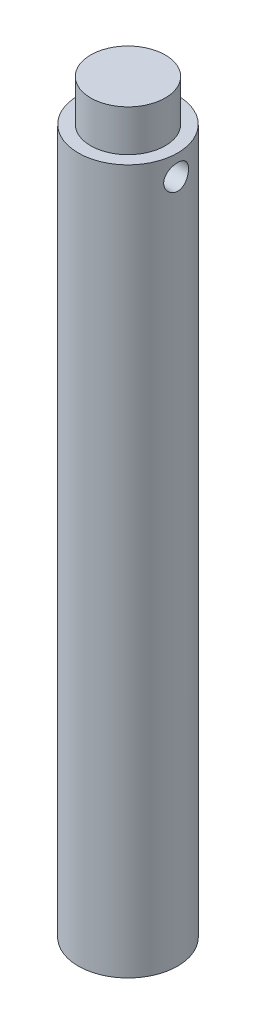
ISO-10303-21;
HEADER;
FILE_DESCRIPTION(('STEP AP214'),'2;1');
FILE_NAME('part.step','',(''),(''),'','','');
FILE_SCHEMA(('AUTOMOTIVE_DESIGN { 1 0 10303 214 1 1 1 1 }'));
ENDSEC;
DATA;
#1=APPLICATION_CONTEXT('core data for automotive mechanical design processes');
#2=APPLICATION_PROTOCOL_DEFINITION('international standard','automotive_design',2000,#1);
#3=PRODUCT_CONTEXT('',#1,'mechanical');
#4=PRODUCT('Part','Part','',(#3));
#5=PRODUCT_RELATED_PRODUCT_CATEGORY('part','',(#4));
#6=PRODUCT_DEFINITION_FORMATION('','',#4);
#7=PRODUCT_DEFINITION_CONTEXT('part definition',#1,'design');
#8=PRODUCT_DEFINITION('design','',#6,#7);
#9=PRODUCT_DEFINITION_SHAPE('','',#8);
#10=(LENGTH_UNIT() NAMED_UNIT(*) SI_UNIT(.MILLI.,.METRE.));
#11=(NAMED_UNIT(*) PLANE_ANGLE_UNIT() SI_UNIT($,.RADIAN.));
#12=(NAMED_UNIT(*) SI_UNIT($,.STERADIAN.) SOLID_ANGLE_UNIT());
#13=UNCERTAINTY_MEASURE_WITH_UNIT(LENGTH_MEASURE(1.E-05),#10,'distance_accuracy_value','');
#14=(GEOMETRIC_REPRESENTATION_CONTEXT(3) GLOBAL_UNCERTAINTY_ASSIGNED_CONTEXT((#13)) GLOBAL_UNIT_ASSIGNED_CONTEXT((#10,
#11,#12)) REPRESENTATION_CONTEXT('',''));
#15=CARTESIAN_POINT('',(0.,0.,0.));
#16=DIRECTION('',(0.,0.,1.));
#17=DIRECTION('',(1.,0.,0.));
#18=AXIS2_PLACEMENT_3D('',#15,#16,#17);
#19=CARTESIAN_POINT('',(0.,-80.,0.));
#20=DIRECTION('',(0.,1.,0.));
#21=DIRECTION('',(0.,0.,1.));
#22=AXIS2_PLACEMENT_3D('',#19,#20,#21);
#23=CYLINDRICAL_SURFACE('',#22,6.);
#24=CARTESIAN_POINT('',(-6.,4.,0.));
#25=CARTESIAN_POINT('',(-5.99999859868013,3.99999767426184,-0.0828760886697311));
#26=CARTESIAN_POINT('',(-5.99826578131828,3.99310844922621,-0.165778157830763));
#27=CARTESIAN_POINT('',(-5.99152113829892,3.965774848693,-0.329206323770533));
#28=CARTESIAN_POINT('',(-5.98650745419968,3.94532279046215,-0.409731046870739));
#29=CARTESIAN_POINT('',(-5.9737562633204,3.89156074653791,-0.566020872182577));
#30=CARTESIAN_POINT('',(-5.96602202842087,3.85826620128472,-0.641791563430003));
#31=CARTESIAN_POINT('',(-5.94865343807593,3.77981860995517,-0.786672131904426));
#32=CARTESIAN_POINT('',(-5.9390190185405,3.73466516388106,-0.855781784348759));
#33=CARTESIAN_POINT('',(-5.91867413591801,3.63279921034579,-0.98680192730092));
#34=CARTESIAN_POINT('',(-5.90794707148533,3.57588842504082,-1.04855569006107));
#35=CARTESIAN_POINT('',(-5.8867362011753,3.45254779509108,-1.1617489272033));
#36=CARTESIAN_POINT('',(-5.87625242288348,3.3861168770535,-1.21318723694913));
#37=CARTESIAN_POINT('',(-5.8565477569971,3.24440477326256,-1.30502654279903));
#38=CARTESIAN_POINT('',(-5.84734794470605,3.1690067691896,-1.34525221592536));
#39=CARTESIAN_POINT('',(-5.83149494812223,3.01225158834164,-1.41239690855053));
#40=CARTESIAN_POINT('',(-5.82484135672789,2.93089536667424,-1.43931805543933));
#41=CARTESIAN_POINT('',(-5.81500476717551,2.76625650179753,-1.47855483680429));
#42=CARTESIAN_POINT('',(-5.81175491075426,2.6830451039502,-1.49115226833334));
#43=CARTESIAN_POINT('',(-5.80889362537741,2.51563143098602,-1.50226177506785));
#44=CARTESIAN_POINT('',(-5.80928160448644,2.43142931930139,-1.50077614181798));
#45=CARTESIAN_POINT('',(-5.81359205496618,2.26658419225552,-1.48398652463928));
#46=CARTESIAN_POINT('',(-5.81742863001879,2.1859043785349,-1.46901834019052));
#47=CARTESIAN_POINT('',(-5.82806709676484,2.02823894908871,-1.42622418690311));
#48=CARTESIAN_POINT('',(-5.83486919970696,1.95125359697102,-1.39839730206942));
#49=CARTESIAN_POINT('',(-5.85075113904187,1.80226198374793,-1.33038947793715));
#50=CARTESIAN_POINT('',(-5.85985327469421,1.73031382821045,-1.29008666723291));
#51=CARTESIAN_POINT('',(-5.87929710846386,1.59408129024316,-1.19835627601495));
#52=CARTESIAN_POINT('',(-5.88963902334735,1.52979825193274,-1.14692674880884));
#53=CARTESIAN_POINT('',(-5.91075880539781,1.4087963843056,-1.03266342468122));
#54=CARTESIAN_POINT('',(-5.92154069477971,1.35234550993865,-0.96954625816586));
#55=CARTESIAN_POINT('',(-5.94205965578786,1.2507787575361,-0.8346119175037));
#56=CARTESIAN_POINT('',(-5.95179669549415,1.20566322573643,-0.762794477707944));
#57=CARTESIAN_POINT('',(-5.96917732094183,1.12794941377561,-0.612115888681391));
#58=CARTESIAN_POINT('',(-5.97681360127725,1.09539465974557,-0.533231393208623));
#59=CARTESIAN_POINT('',(-5.98907916991419,1.04408269429043,-0.370876008142882));
#60=CARTESIAN_POINT('',(-5.99370903339281,1.02532284358186,-0.287405999150485));
#61=CARTESIAN_POINT('',(-5.99935499271375,1.00254243444116,-0.120539970390027));
#62=CARTESIAN_POINT('',(-6.00046053508279,0.998156973924699,-0.0371967199882099));
#63=CARTESIAN_POINT('',(-5.99918804814451,1.00324900205549,0.129032874801508));
#64=CARTESIAN_POINT('',(-5.99681033241847,1.01272524279913,0.211919259644595));
#65=CARTESIAN_POINT('',(-5.98889581127357,1.04497090839138,0.373614268776492));
#66=CARTESIAN_POINT('',(-5.98340634185811,1.06754126347699,0.452465118968755));
#67=CARTESIAN_POINT('',(-5.96988706634134,1.12510708402845,0.605257292452511));
#68=CARTESIAN_POINT('',(-5.96185700369892,1.16010380431317,0.679198119032635));
#69=CARTESIAN_POINT('',(-5.9439330792631,1.24223612887473,0.821523134429848));
#70=CARTESIAN_POINT('',(-5.93400867366932,1.28957611239676,0.889785441835831));
#71=CARTESIAN_POINT('',(-5.91344509187419,1.39478990879697,1.01752661364325));
#72=CARTESIAN_POINT('',(-5.90280579251705,1.45266553961691,1.07700395897301));
#73=CARTESIAN_POINT('',(-5.88168956960771,1.57900196084446,1.18699056807273));
#74=CARTESIAN_POINT('',(-5.87122304187281,1.64768770300242,1.23724386762203));
#75=CARTESIAN_POINT('',(-5.85192878377239,1.79273263446572,1.3255107590127));
#76=CARTESIAN_POINT('',(-5.84310098067026,1.86909148295975,1.36352489415794));
#77=CARTESIAN_POINT('',(-5.82818094734665,2.02690572241308,1.42595142060929));
#78=CARTESIAN_POINT('',(-5.82207255291906,2.10832762834401,1.45044439665406));
#79=CARTESIAN_POINT('',(-5.81326744090184,2.27430963788911,1.48534565995378));
#80=CARTESIAN_POINT('',(-5.81056997719936,2.35886905103249,1.49575702747866));
#81=CARTESIAN_POINT('',(-5.80894901203957,2.5261210238552,1.50203859033399));
#82=CARTESIAN_POINT('',(-5.80991932728264,2.60879743512473,1.49831789778012));
#83=CARTESIAN_POINT('',(-5.81527909007843,2.77230388866798,1.47737727831287));
#84=CARTESIAN_POINT('',(-5.81966846891857,2.85313396801365,1.46015762268677));
#85=CARTESIAN_POINT('',(-5.83131260682723,3.01020845906541,1.41293131944279));
#86=CARTESIAN_POINT('',(-5.8385501523631,3.08647730524021,1.38300140468038));
#87=CARTESIAN_POINT('',(-5.85507755724829,3.23296538271369,1.31126491360507));
#88=CARTESIAN_POINT('',(-5.86436770120773,3.30318377318692,1.26945669003419));
#89=CARTESIAN_POINT('',(-5.88425634263512,3.43755462900202,1.17386774863714));
#90=CARTESIAN_POINT('',(-5.89488264831757,3.50150107342396,1.11980316291225));
#91=CARTESIAN_POINT('',(-5.91608027246286,3.61954704479541,1.00178937118973));
#92=CARTESIAN_POINT('',(-5.9266515772706,3.67364423011297,0.937837821261145));
#93=CARTESIAN_POINT('',(-5.94677655647663,3.77141130856461,0.800467586702589));
#94=CARTESIAN_POINT('',(-5.95630833365868,3.81487461367158,0.726898422316385));
#95=CARTESIAN_POINT('',(-5.97304924975118,3.88874746294053,0.573266059510474));
#96=CARTESIAN_POINT('',(-5.98026005199781,3.91916636064854,0.493207563436738));
#97=CARTESIAN_POINT('',(-5.99048059565542,3.96157183032965,0.34441025324347));
#98=CARTESIAN_POINT('',(-5.99402585052691,3.97595124305343,0.276380170908067));
#99=CARTESIAN_POINT('',(-5.99878605231948,3.99516594362194,0.138906071536282));
#100=CARTESIAN_POINT('',(-6.00000117450894,4.0000019493053,0.0694621612426158));
#101=CARTESIAN_POINT('',(-6.,4.,0.));
#102=B_SPLINE_CURVE_WITH_KNOTS('',3,(#24,#25,#26,#27,#28,#29,#30,#31,#32,#33,#34,#35,#36,#37,
#38,#39,#40,#41,#42,#43,#44,#45,#46,#47,#48,#49,#50,#51,#52,#53,#54,#55,#56,#57,#58,#59,#60,#61,
#62,#63,#64,#65,#66,#67,#68,#69,#70,#71,#72,#73,#74,#75,#76,#77,#78,#79,#80,#81,#82,#83,#84,#85,
#86,#87,#88,#89,#90,#91,#92,#93,#94,#95,#96,#97,#98,#99,#100,#101),.UNSPECIFIED.,.T.,.F.,(4,2,2,
2,2,2,2,2,2,2,2,2,2,2,2,2,2,2,2,2,2,2,2,2,2,2,2,2,2,2,2,2,2,2,2,2,2,2,4),(0.,0.24837371247189,
0.4968882377639,0.745104902286106,0.993329940169328,1.24614435437139,1.49898729580062,
1.75558647545807,2.01214461169368,2.2635629509943,2.51494038112697,2.76022497007018,
3.00552703466038,3.25330527873879,3.50112690836163,3.75601500969019,4.01091089558247,
4.26668229009114,4.52240473688643,4.77158308949276,5.02073901112743,5.26620274514037,
5.51169127322291,5.76153587565352,6.01142363008019,6.26744509204476,6.52345518749508,
6.77792254614036,7.03233423252408,7.27943780398612,7.52653640956034,7.77216400559447,
8.01782568136901,8.2698957640991,8.52202569770418,8.77872185499588,9.0352336382135,
9.24342242942149,9.45159556043039),.UNSPECIFIED.);
#103=CARTESIAN_POINT('',(-6.,4.,0.));
#104=VERTEX_POINT('',#103);
#105=EDGE_CURVE('E10',#104,#104,#102,.T.);
#106=ORIENTED_EDGE('',*,*,#105,.F.);
#107=EDGE_LOOP('',(#106));
#108=FACE_BOUND('',#107,.T.);
#109=CARTESIAN_POINT('',(5.80947501931113,2.5,-1.5));
#110=CARTESIAN_POINT('',(5.80947660051185,2.58283045055477,-1.49999764715507));
#111=CARTESIAN_POINT('',(5.81126583608348,2.6656869392068,-1.49311574729838));
#112=CARTESIAN_POINT('',(5.81821117195949,2.82902054690442,-1.46581387527848));
#113=CARTESIAN_POINT('',(5.82336923173088,2.909496252681,-1.44538602404532));
#114=CARTESIAN_POINT('',(5.8364323475758,3.06568212291222,-1.39169471977917));
#115=CARTESIAN_POINT('',(5.84433385614245,3.1413982932314,-1.35844783671268));
#116=CARTESIAN_POINT('',(5.86198915217285,3.28618651152395,-1.28011268475685));
#117=CARTESIAN_POINT('',(5.87174301827101,3.35525827724814,-1.23502391313642));
#118=CARTESIAN_POINT('',(5.89224429813367,3.48631698715732,-1.13322505638712));
#119=CARTESIAN_POINT('',(5.90300758573818,3.54813616021003,-1.07630213262243));
#120=CARTESIAN_POINT('',(5.92417725309178,3.66145683661621,-0.952909238460399));
#121=CARTESIAN_POINT('',(5.93458359939834,3.71295737537305,-0.886438376508185));
#122=CARTESIAN_POINT('',(5.95404249312349,3.80486528057877,-0.744687120647373));
#123=CARTESIAN_POINT('',(5.96307412440355,3.84510783289688,-0.669296745717073));
#124=CARTESIAN_POINT('',(5.9785848715559,3.91228578649185,-0.512557910575659));
#125=CARTESIAN_POINT('',(5.98506436400607,3.93922315114931,-0.431210331475166));
#126=CARTESIAN_POINT('',(5.99462855308908,3.97848870074715,-0.266615255252498));
#127=CARTESIAN_POINT('',(5.99777936306589,3.99110178659595,-0.183439631729387));
#128=CARTESIAN_POINT('',(6.00056156464379,4.00225502756533,-0.0160972915576628));
#129=CARTESIAN_POINT('',(6.00019347658022,4.00079726332576,0.0680692767228401));
#130=CARTESIAN_POINT('',(5.99602856972121,3.98405508984991,0.23302837075858));
#131=CARTESIAN_POINT('',(5.99230801404524,3.96907820496769,0.3138543234016));
#132=CARTESIAN_POINT('',(5.98194501914912,3.9262172379709,0.471807371120529));
#133=CARTESIAN_POINT('',(5.97530242439065,3.89833246877355,0.548934269055656));
#134=CARTESIAN_POINT('',(5.95972505820537,3.83019845758776,0.698110055252709));
#135=CARTESIAN_POINT('',(5.95077011817032,3.78983977320295,0.770106764649756));
#136=CARTESIAN_POINT('',(5.9315394228579,3.69798659253025,0.906413433510733));
#137=CARTESIAN_POINT('',(5.92126343791494,3.64649015886363,0.970722052628258));
#138=CARTESIAN_POINT('',(5.90018228261712,3.53217475481057,1.09166105262743));
#139=CARTESIAN_POINT('',(5.88937031715551,3.46908706459134,1.1480365186128));
#140=CARTESIAN_POINT('',(5.86869026110024,3.33424001587585,1.24946456394453));
#141=CARTESIAN_POINT('',(5.85882221463582,3.2624802523054,1.29451661406902));
#142=CARTESIAN_POINT('',(5.84112298098989,3.11182597951062,1.3721821935339));
#143=CARTESIAN_POINT('',(5.83330190235432,3.03289856181208,1.40473435045574));
#144=CARTESIAN_POINT('',(5.82071184083974,2.87044871915413,1.45602843095451));
#145=CARTESIAN_POINT('',(5.81594220486131,2.78692728161012,1.47477330982936));
#146=CARTESIAN_POINT('',(5.81013213623485,2.62002429908613,1.49749778319911));
#147=CARTESIAN_POINT('',(5.80899653456189,2.53669732400222,1.50185428435178));
#148=CARTESIAN_POINT('',(5.81032406088624,2.37050683805311,1.49671019430933));
#149=CARTESIAN_POINT('',(5.8127868576076,2.28764328522926,1.48721087870928));
#150=CARTESIAN_POINT('',(5.82094249172736,2.12613144102718,1.4549552783626));
#151=CARTESIAN_POINT('',(5.82658182140625,2.04743636405749,1.43241844096905));
#152=CARTESIAN_POINT('',(5.84040430962578,1.89494112528899,1.37497084900237));
#153=CARTESIAN_POINT('',(5.84858776949168,1.8211415445668,1.34005862862753));
#154=CARTESIAN_POINT('',(5.86677682255958,1.67893523327959,1.25806240076193));
#155=CARTESIAN_POINT('',(5.87681501163985,1.61066269597414,1.21075305230138));
#156=CARTESIAN_POINT('',(5.8975024984303,1.48288698231919,1.10559043940168));
#157=CARTESIAN_POINT('',(5.90815189637082,1.42338525000996,1.04773544220816));
#158=CARTESIAN_POINT('',(5.92918441818964,1.31331337445743,0.921394081477089));
#159=CARTESIAN_POINT('',(5.93955421237102,1.26300396247071,0.85267792879739));
#160=CARTESIAN_POINT('',(5.95858329968241,1.17463847982925,0.707554024042014));
#161=CARTESIAN_POINT('',(5.96724268202376,1.13658177003508,0.631146673436387));
#162=CARTESIAN_POINT('',(5.98182069442989,1.07413237928324,0.473337302596636));
#163=CARTESIAN_POINT('',(5.98775898013446,1.04964142937256,0.391976071541822));
#164=CARTESIAN_POINT('',(5.99631176037473,1.01472379923495,0.226124640478212));
#165=CARTESIAN_POINT('',(5.99892689636045,1.00429440475657,0.141635047561866));
#166=CARTESIAN_POINT('',(6.00051254113217,0.997948615636699,-0.0256252896649889));
#167=CARTESIAN_POINT('',(5.99957968320012,1.00164743635691,-0.108380740449049));
#168=CARTESIAN_POINT('',(5.99438844686135,1.0225717409415,-0.272051244622109));
#169=CARTESIAN_POINT('',(5.99013016735643,1.03979682251965,-0.352966352671329));
#170=CARTESIAN_POINT('',(5.97878149280944,1.08707832965639,-0.510256553467224));
#171=CARTESIAN_POINT('',(5.97170646753999,1.11706517997194,-0.586653741871528));
#172=CARTESIAN_POINT('',(5.95546933370076,1.18895586852899,-0.733375579562202));
#173=CARTESIAN_POINT('',(5.94630696206604,1.23086120900435,-0.803699461897577));
#174=CARTESIAN_POINT('',(5.92660874521999,1.32657285099561,-0.938102892635849));
#175=CARTESIAN_POINT('',(5.91604525418417,1.38064021436107,-1.00199248245088));
#176=CARTESIAN_POINT('',(5.89485973579863,1.4986342779607,-1.11992253040688));
#177=CARTESIAN_POINT('',(5.88423769428834,1.56256347414686,-1.17396048760228));
#178=CARTESIAN_POINT('',(5.86391213790822,1.699902121302,-1.27164303971884));
#179=CARTESIAN_POINT('',(5.85422945594827,1.77346618511894,-1.31507492916982));
#180=CARTESIAN_POINT('',(5.83715933325924,1.92708323488405,-1.3888903449235));
#181=CARTESIAN_POINT('',(5.82977022370054,2.00713144916011,-1.41928336463958));
#182=CARTESIAN_POINT('',(5.81927863109675,2.15586551774007,-1.46163379284816));
#183=CARTESIAN_POINT('',(5.8156299450082,2.22383974657579,-1.47598975589307));
#184=CARTESIAN_POINT('',(5.81072757878358,2.36120330349995,-1.4951734388599));
#185=CARTESIAN_POINT('',(5.80947369434945,2.43059251036759,-1.50000197155828));
#186=CARTESIAN_POINT('',(5.80947501931113,2.5,-1.5));
#187=B_SPLINE_CURVE_WITH_KNOTS('',3,(#109,#110,#111,#112,#113,#114,#115,#116,#117,#118,#119,
#120,#121,#122,#123,#124,#125,#126,#127,#128,#129,#130,#131,#132,#133,#134,#135,#136,#137,#138,
#139,#140,#141,#142,#143,#144,#145,#146,#147,#148,#149,#150,#151,#152,#153,#154,#155,#156,#157,
#158,#159,#160,#161,#162,#163,#164,#165,#166,#167,#168,#169,#170,#171,#172,#173,#174,#175,#176,
#177,#178,#179,#180,#181,#182,#183,#184,#185,#186),.UNSPECIFIED.,.T.,.F.,(4,2,2,2,2,2,2,2,2,2,2,
2,2,2,2,2,2,2,2,2,2,2,2,2,2,2,2,2,2,2,2,2,2,2,2,2,2,2,4),(0.,0.248236465041682,
0.496617444857199,0.744678436299612,0.992749960532871,1.24574372515786,1.4987611288792,
1.75530897838752,2.01181895908255,2.26313250597208,2.51440889199612,2.76010957613368,
3.00582334034872,3.25375724552667,3.50173431281348,3.75642279943147,4.01112318719881,
4.26705859205041,4.52293920077728,4.7720614485703,5.02116076310281,5.26618443005524,
5.5112371285285,5.76109707515494,6.01099811331027,6.26715198579191,6.52329249431732,
6.77755243684157,7.03176329345423,7.27910067676474,7.52643070426189,7.77242925935826,
8.01845883442843,8.27038257949243,8.52237018939305,8.77905886370806,9.03556032819972,
9.24358696306398,9.45159585059712),.UNSPECIFIED.);
#188=CARTESIAN_POINT('',(5.80947501931113,2.5,-1.5));
#189=VERTEX_POINT('',#188);
#190=EDGE_CURVE('E43',#189,#189,#187,.T.);
#191=ORIENTED_EDGE('',*,*,#190,.F.);
#192=EDGE_LOOP('',(#191));
#193=FACE_BOUND('',#192,.T.);
#194=CARTESIAN_POINT('',(0.,-80.,0.));
#195=DIRECTION('',(0.,1.,0.));
#196=DIRECTION('',(0.,0.,1.));
#197=AXIS2_PLACEMENT_3D('',#194,#195,#196);
#198=CIRCLE('',#197,6.);
#199=CARTESIAN_POINT('',(0.,-80.,6.));
#200=VERTEX_POINT('',#199);
#201=EDGE_CURVE('E47',#200,#200,#198,.T.);
#202=ORIENTED_EDGE('',*,*,#201,.T.);
#203=EDGE_LOOP('',(#202));
#204=FACE_BOUND('',#203,.T.);
#205=CARTESIAN_POINT('',(0.,5.,0.));
#206=DIRECTION('',(0.,1.,0.));
#207=DIRECTION('',(0.,0.,1.));
#208=AXIS2_PLACEMENT_3D('',#205,#206,#207);
#209=CIRCLE('',#208,6.);
#210=CARTESIAN_POINT('',(0.,5.,6.));
#211=VERTEX_POINT('',#210);
#212=EDGE_CURVE('E86',#211,#211,#209,.T.);
#213=ORIENTED_EDGE('',*,*,#212,.F.);
#214=EDGE_LOOP('',(#213));
#215=FACE_BOUND('',#214,.T.);
#216=ADVANCED_FACE('F33',(#108,#193,#204,#215),#23,.T.);
#217=CARTESIAN_POINT('',(0.,-80.,0.));
#218=DIRECTION('',(0.,1.,0.));
#219=DIRECTION('',(0.,0.,1.));
#220=AXIS2_PLACEMENT_3D('',#217,#218,#219);
#221=PLANE('',#220);
#222=ORIENTED_EDGE('',*,*,#201,.F.);
#223=EDGE_LOOP('',(#222));
#224=FACE_BOUND('',#223,.T.);
#225=ADVANCED_FACE('F67',(#224),#221,.F.);
#226=CARTESIAN_POINT('',(0.,5.,0.));
#227=DIRECTION('',(0.,1.,0.));
#228=DIRECTION('',(0.,0.,1.));
#229=AXIS2_PLACEMENT_3D('',#226,#227,#228);
#230=PLANE('',#229);
#231=CARTESIAN_POINT('',(0.,5.,0.));
#232=DIRECTION('',(0.,1.,0.));
#233=DIRECTION('',(0.,0.,1.));
#234=AXIS2_PLACEMENT_3D('',#231,#232,#233);
#235=CIRCLE('',#234,4.5);
#236=CARTESIAN_POINT('',(0.,5.,4.5));
#237=VERTEX_POINT('',#236);
#238=EDGE_CURVE('E56',#237,#237,#235,.T.);
#239=ORIENTED_EDGE('',*,*,#238,.F.);
#240=EDGE_LOOP('',(#239));
#241=FACE_BOUND('',#240,.T.);
#242=ORIENTED_EDGE('',*,*,#212,.T.);
#243=EDGE_LOOP('',(#242));
#244=FACE_BOUND('',#243,.T.);
#245=ADVANCED_FACE('F62',(#241,#244),#230,.T.);
#246=CARTESIAN_POINT('',(0.,10.,0.));
#247=DIRECTION('',(0.,1.,0.));
#248=DIRECTION('',(0.,0.,1.));
#249=AXIS2_PLACEMENT_3D('',#246,#247,#248);
#250=PLANE('',#249);
#251=CARTESIAN_POINT('',(0.,10.,0.));
#252=DIRECTION('',(0.,1.,0.));
#253=DIRECTION('',(0.,0.,1.));
#254=AXIS2_PLACEMENT_3D('',#251,#252,#253);
#255=CIRCLE('',#254,4.5);
#256=CARTESIAN_POINT('',(0.,10.,4.5));
#257=VERTEX_POINT('',#256);
#258=EDGE_CURVE('E51',#257,#257,#255,.T.);
#259=ORIENTED_EDGE('',*,*,#258,.T.);
#260=EDGE_LOOP('',(#259));
#261=FACE_BOUND('',#260,.T.);
#262=ADVANCED_FACE('F66',(#261),#250,.T.);
#263=CARTESIAN_POINT('',(0.,10.,0.));
#264=DIRECTION('',(0.,-1.,0.));
#265=DIRECTION('',(0.,0.,-1.));
#266=AXIS2_PLACEMENT_3D('',#263,#264,#265);
#267=CYLINDRICAL_SURFACE('',#266,4.5);
#268=ORIENTED_EDGE('',*,*,#238,.T.);
#269=EDGE_LOOP('',(#268));
#270=FACE_BOUND('',#269,.T.);
#271=ORIENTED_EDGE('',*,*,#258,.F.);
#272=EDGE_LOOP('',(#271));
#273=FACE_BOUND('',#272,.T.);
#274=ADVANCED_FACE('F61',(#270,#273),#267,.T.);
#275=CARTESIAN_POINT('',(-6.,2.5,0.));
#276=DIRECTION('',(1.,0.,0.));
#277=DIRECTION('',(0.,0.,-1.));
#278=AXIS2_PLACEMENT_3D('',#275,#276,#277);
#279=CYLINDRICAL_SURFACE('',#278,1.5);
#280=ORIENTED_EDGE('',*,*,#105,.T.);
#281=EDGE_LOOP('',(#280));
#282=FACE_BOUND('',#281,.T.);
#283=ORIENTED_EDGE('',*,*,#190,.T.);
#284=EDGE_LOOP('',(#283));
#285=FACE_BOUND('',#284,.T.);
#286=ADVANCED_FACE('F57',(#282,#285),#279,.F.);
#287=CLOSED_SHELL('',(#216,#225,#245,#262,#274,#286));
#288=MANIFOLD_SOLID_BREP('B2',#287);
#289=ADVANCED_BREP_SHAPE_REPRESENTATION('',(#18,#288),#14);
#290=SHAPE_DEFINITION_REPRESENTATION(#9,#289);
ENDSEC;
END-ISO-10303-21;
